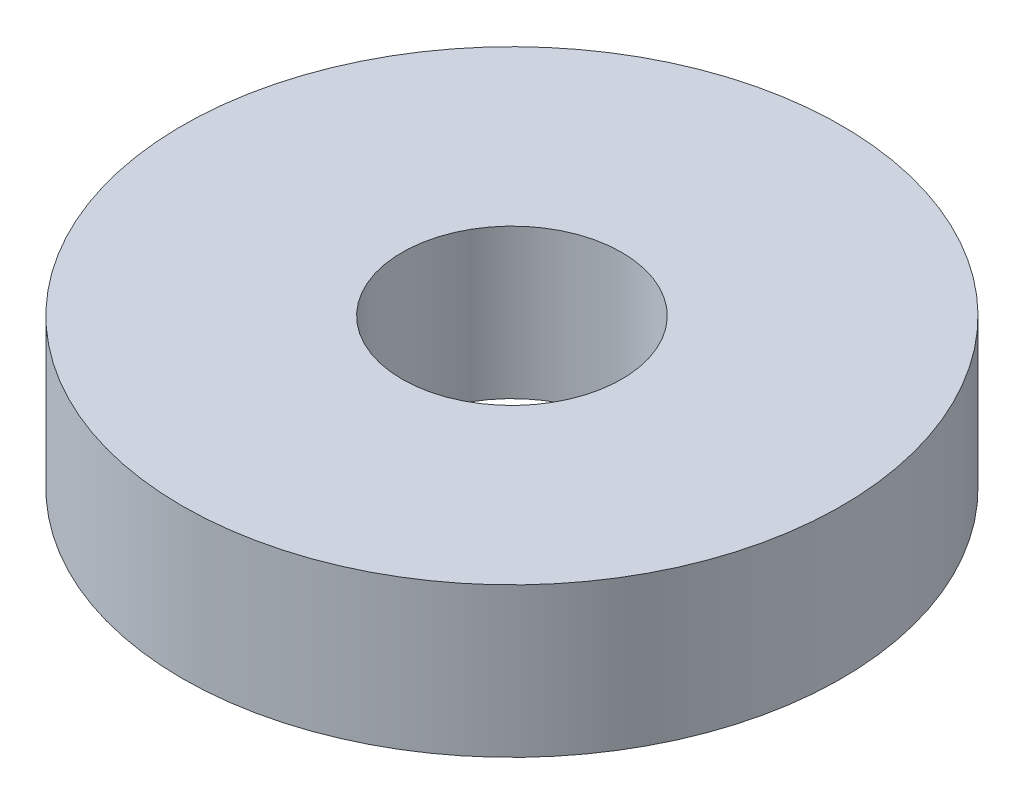
ISO-10303-21;
HEADER;
FILE_DESCRIPTION(('STEP AP214'),'2;1');
FILE_NAME('part.step','',(''),(''),'','','');
FILE_SCHEMA(('AUTOMOTIVE_DESIGN { 1 0 10303 214 1 1 1 1 }'));
ENDSEC;
DATA;
#1=APPLICATION_CONTEXT('core data for automotive mechanical design processes');
#2=APPLICATION_PROTOCOL_DEFINITION('international standard','automotive_design',2000,#1);
#3=PRODUCT_CONTEXT('',#1,'mechanical');
#4=PRODUCT('Part','Part','',(#3));
#5=PRODUCT_RELATED_PRODUCT_CATEGORY('part','',(#4));
#6=PRODUCT_DEFINITION_FORMATION('','',#4);
#7=PRODUCT_DEFINITION_CONTEXT('part definition',#1,'design');
#8=PRODUCT_DEFINITION('design','',#6,#7);
#9=PRODUCT_DEFINITION_SHAPE('','',#8);
#10=(LENGTH_UNIT() NAMED_UNIT(*) SI_UNIT(.MILLI.,.METRE.));
#11=(NAMED_UNIT(*) PLANE_ANGLE_UNIT() SI_UNIT($,.RADIAN.));
#12=(NAMED_UNIT(*) SI_UNIT($,.STERADIAN.) SOLID_ANGLE_UNIT());
#13=UNCERTAINTY_MEASURE_WITH_UNIT(LENGTH_MEASURE(1.E-05),#10,'distance_accuracy_value','');
#14=(GEOMETRIC_REPRESENTATION_CONTEXT(3) GLOBAL_UNCERTAINTY_ASSIGNED_CONTEXT((#13)) GLOBAL_UNIT_ASSIGNED_CONTEXT((#10,
#11,#12)) REPRESENTATION_CONTEXT('',''));
#15=CARTESIAN_POINT('',(0.,0.,0.));
#16=DIRECTION('',(0.,0.,1.));
#17=DIRECTION('',(1.,0.,0.));
#18=AXIS2_PLACEMENT_3D('',#15,#16,#17);
#19=CARTESIAN_POINT('',(0.,3.4,0.));
#20=DIRECTION('',(0.,1.,0.));
#21=DIRECTION('',(0.,0.,1.));
#22=AXIS2_PLACEMENT_3D('',#19,#20,#21);
#23=PLANE('',#22);
#24=CARTESIAN_POINT('',(0.,3.4,0.));
#25=DIRECTION('',(0.,1.,0.));
#26=DIRECTION('',(0.,0.,1.));
#27=AXIS2_PLACEMENT_3D('',#24,#25,#26);
#28=CIRCLE('',#27,7.5);
#29=CARTESIAN_POINT('',(0.,3.4,7.5));
#30=VERTEX_POINT('',#29);
#31=EDGE_CURVE('E10',#30,#30,#28,.T.);
#32=ORIENTED_EDGE('',*,*,#31,.T.);
#33=EDGE_LOOP('',(#32));
#34=FACE_BOUND('',#33,.T.);
#35=CARTESIAN_POINT('',(0.,3.4,0.));
#36=DIRECTION('',(0.,1.,0.));
#37=DIRECTION('',(0.,0.,1.));
#38=AXIS2_PLACEMENT_3D('',#35,#36,#37);
#39=CIRCLE('',#38,2.5);
#40=CARTESIAN_POINT('',(0.,3.4,2.5));
#41=VERTEX_POINT('',#40);
#42=EDGE_CURVE('E54',#41,#41,#39,.T.);
#43=ORIENTED_EDGE('',*,*,#42,.F.);
#44=EDGE_LOOP('',(#43));
#45=FACE_BOUND('',#44,.T.);
#46=ADVANCED_FACE('F41',(#34,#45),#23,.T.);
#47=CARTESIAN_POINT('',(0.,0.,0.));
#48=DIRECTION('',(0.,1.,0.));
#49=DIRECTION('',(0.,0.,1.));
#50=AXIS2_PLACEMENT_3D('',#47,#48,#49);
#51=PLANE('',#50);
#52=CARTESIAN_POINT('',(0.,0.,0.));
#53=DIRECTION('',(0.,1.,0.));
#54=DIRECTION('',(0.,0.,1.));
#55=AXIS2_PLACEMENT_3D('',#52,#53,#54);
#56=CIRCLE('',#55,7.5);
#57=CARTESIAN_POINT('',(0.,0.,7.5));
#58=VERTEX_POINT('',#57);
#59=EDGE_CURVE('E45',#58,#58,#56,.T.);
#60=ORIENTED_EDGE('',*,*,#59,.F.);
#61=EDGE_LOOP('',(#60));
#62=FACE_BOUND('',#61,.T.);
#63=CARTESIAN_POINT('',(0.,0.,0.));
#64=DIRECTION('',(0.,1.,0.));
#65=DIRECTION('',(0.,0.,1.));
#66=AXIS2_PLACEMENT_3D('',#63,#64,#65);
#67=CIRCLE('',#66,2.5);
#68=CARTESIAN_POINT('',(0.,0.,2.5));
#69=VERTEX_POINT('',#68);
#70=EDGE_CURVE('E56',#69,#69,#67,.T.);
#71=ORIENTED_EDGE('',*,*,#70,.T.);
#72=EDGE_LOOP('',(#71));
#73=FACE_BOUND('',#72,.T.);
#74=ADVANCED_FACE('F68',(#62,#73),#51,.F.);
#75=CARTESIAN_POINT('',(0.,3.4,0.));
#76=DIRECTION('',(0.,-1.,0.));
#77=DIRECTION('',(0.,0.,-1.));
#78=AXIS2_PLACEMENT_3D('',#75,#76,#77);
#79=CYLINDRICAL_SURFACE('',#78,7.5);
#80=ORIENTED_EDGE('',*,*,#31,.F.);
#81=EDGE_LOOP('',(#80));
#82=FACE_BOUND('',#81,.T.);
#83=ORIENTED_EDGE('',*,*,#59,.T.);
#84=EDGE_LOOP('',(#83));
#85=FACE_BOUND('',#84,.T.);
#86=ADVANCED_FACE('F43',(#82,#85),#79,.T.);
#87=CARTESIAN_POINT('',(0.,3.4,0.));
#88=DIRECTION('',(0.,-1.,0.));
#89=DIRECTION('',(0.,0.,-1.));
#90=AXIS2_PLACEMENT_3D('',#87,#88,#89);
#91=CYLINDRICAL_SURFACE('',#90,2.5);
#92=ORIENTED_EDGE('',*,*,#42,.T.);
#93=EDGE_LOOP('',(#92));
#94=FACE_BOUND('',#93,.T.);
#95=ORIENTED_EDGE('',*,*,#70,.F.);
#96=EDGE_LOOP('',(#95));
#97=FACE_BOUND('',#96,.T.);
#98=ADVANCED_FACE('F64',(#94,#97),#91,.F.);
#99=CLOSED_SHELL('',(#46,#74,#86,#98));
#100=MANIFOLD_SOLID_BREP('B2',#99);
#101=ADVANCED_BREP_SHAPE_REPRESENTATION('',(#18,#100),#14);
#102=SHAPE_DEFINITION_REPRESENTATION(#9,#101);
ENDSEC;
END-ISO-10303-21;
